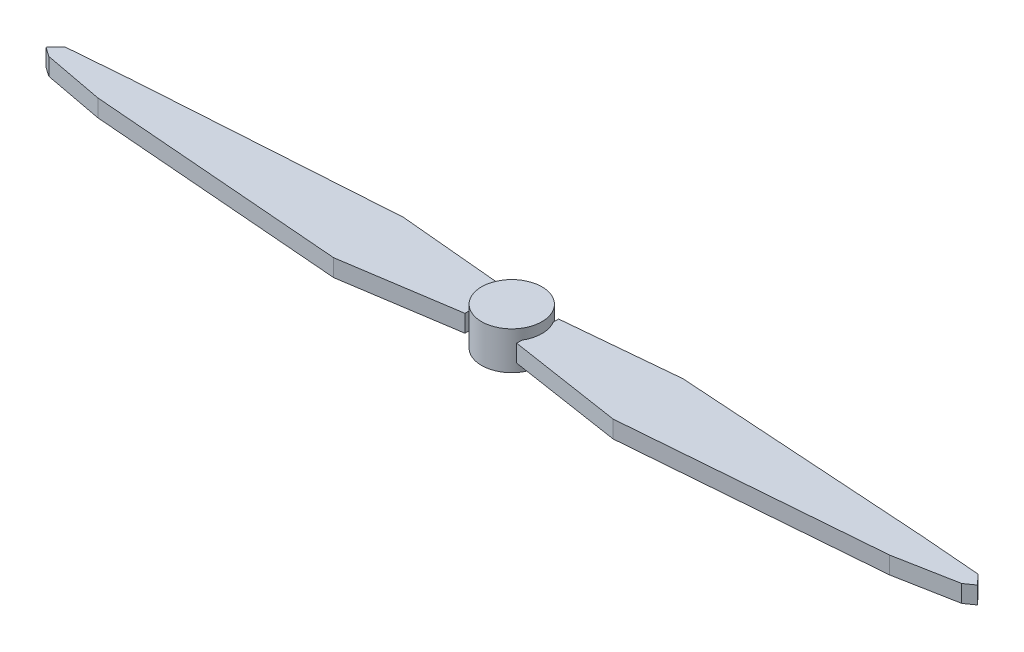
ISO-10303-21;
HEADER;
FILE_DESCRIPTION(('STEP AP214'),'2;1');
FILE_NAME('part.step','',(''),(''),'','','');
FILE_SCHEMA(('AUTOMOTIVE_DESIGN { 1 0 10303 214 1 1 1 1 }'));
ENDSEC;
DATA;
#1=APPLICATION_CONTEXT('core data for automotive mechanical design processes');
#2=APPLICATION_PROTOCOL_DEFINITION('international standard','automotive_design',2000,#1);
#3=PRODUCT_CONTEXT('',#1,'mechanical');
#4=PRODUCT('Part','Part','',(#3));
#5=PRODUCT_RELATED_PRODUCT_CATEGORY('part','',(#4));
#6=PRODUCT_DEFINITION_FORMATION('','',#4);
#7=PRODUCT_DEFINITION_CONTEXT('part definition',#1,'design');
#8=PRODUCT_DEFINITION('design','',#6,#7);
#9=PRODUCT_DEFINITION_SHAPE('','',#8);
#10=(LENGTH_UNIT() NAMED_UNIT(*) SI_UNIT(.MILLI.,.METRE.));
#11=(NAMED_UNIT(*) PLANE_ANGLE_UNIT() SI_UNIT($,.RADIAN.));
#12=(NAMED_UNIT(*) SI_UNIT($,.STERADIAN.) SOLID_ANGLE_UNIT());
#13=UNCERTAINTY_MEASURE_WITH_UNIT(LENGTH_MEASURE(1.E-05),#10,'distance_accuracy_value','');
#14=(GEOMETRIC_REPRESENTATION_CONTEXT(3) GLOBAL_UNCERTAINTY_ASSIGNED_CONTEXT((#13)) GLOBAL_UNIT_ASSIGNED_CONTEXT((#10,
#11,#12)) REPRESENTATION_CONTEXT('',''));
#15=CARTESIAN_POINT('',(0.,0.,0.));
#16=DIRECTION('',(0.,0.,1.));
#17=DIRECTION('',(1.,0.,0.));
#18=AXIS2_PLACEMENT_3D('',#15,#16,#17);
#19=CARTESIAN_POINT('',(12.,4.,-9.7155));
#20=DIRECTION('',(1.,0.,0.));
#21=DIRECTION('',(0.,0.,-1.));
#22=AXIS2_PLACEMENT_3D('',#19,#20,#21);
#23=PLANE('',#22);
#24=DIRECTION('',(0.,-1.,0.));
#25=VECTOR('',#24,1.);
#26=CARTESIAN_POINT('',(12.,8.8,7.21110255092798));
#27=LINE('',#26,#25);
#28=CARTESIAN_POINT('',(12.,-4.,7.21110255092798));
#29=VERTEX_POINT('',#28);
#30=CARTESIAN_POINT('',(12.,4.,7.21110255092798));
#31=VERTEX_POINT('',#30);
#32=EDGE_CURVE('E239',#29,#31,#27,.F.);
#33=ORIENTED_EDGE('',*,*,#32,.F.);
#34=DIRECTION('',(0.,0.,1.));
#35=VECTOR('',#34,1.);
#36=CARTESIAN_POINT('',(12.,-4.,-9.7155));
#37=LINE('',#36,#35);
#38=CARTESIAN_POINT('',(12.,-4.,9.7155));
#39=VERTEX_POINT('',#38);
#40=EDGE_CURVE('E243',#29,#39,#37,.T.);
#41=ORIENTED_EDGE('',*,*,#40,.T.);
#42=DIRECTION('',(0.,-1.,0.));
#43=VECTOR('',#42,1.);
#44=CARTESIAN_POINT('',(12.,4.,9.7155));
#45=LINE('',#44,#43);
#46=CARTESIAN_POINT('',(12.,4.,9.7155));
#47=VERTEX_POINT('',#46);
#48=EDGE_CURVE('E307',#47,#39,#45,.T.);
#49=ORIENTED_EDGE('',*,*,#48,.F.);
#50=DIRECTION('',(0.,0.,1.));
#51=VECTOR('',#50,1.);
#52=CARTESIAN_POINT('',(12.,4.,-9.7155));
#53=LINE('',#52,#51);
#54=EDGE_CURVE('E248',#31,#47,#53,.T.);
#55=ORIENTED_EDGE('',*,*,#54,.F.);
#56=EDGE_LOOP('',(#33,#41,#49,#55));
#57=FACE_BOUND('',#56,.T.);
#58=ADVANCED_FACE('F39',(#57),#23,.F.);
#59=DIRECTION('',(0.,-1.,0.));
#60=VECTOR('',#59,1.);
#61=CARTESIAN_POINT('',(12.,8.8,-7.21110255092798));
#62=LINE('',#61,#60);
#63=CARTESIAN_POINT('',(12.,4.,-7.21110255092798));
#64=VERTEX_POINT('',#63);
#65=CARTESIAN_POINT('',(12.,-4.,-7.21110255092798));
#66=VERTEX_POINT('',#65);
#67=EDGE_CURVE('E236',#64,#66,#62,.T.);
#68=ORIENTED_EDGE('',*,*,#67,.F.);
#69=CARTESIAN_POINT('',(12.,4.,-9.7155));
#70=VERTEX_POINT('',#69);
#71=EDGE_CURVE('E244',#70,#64,#53,.T.);
#72=ORIENTED_EDGE('',*,*,#71,.F.);
#73=DIRECTION('',(0.,-1.,0.));
#74=VECTOR('',#73,1.);
#75=CARTESIAN_POINT('',(12.,4.,-9.7155));
#76=LINE('',#75,#74);
#77=CARTESIAN_POINT('',(12.,-4.,-9.7155));
#78=VERTEX_POINT('',#77);
#79=EDGE_CURVE('E264',#70,#78,#76,.T.);
#80=ORIENTED_EDGE('',*,*,#79,.T.);
#81=EDGE_CURVE('E265',#78,#66,#37,.T.);
#82=ORIENTED_EDGE('',*,*,#81,.T.);
#83=EDGE_LOOP('',(#68,#72,#80,#82));
#84=FACE_BOUND('',#83,.T.);
#85=ADVANCED_FACE('F395',(#84),#23,.F.);
#86=CARTESIAN_POINT('',(12.,4.,9.7155));
#87=DIRECTION('',(0.151650746893093,0.,-0.988434140935433));
#88=DIRECTION('',(-0.988434140935433,0.,-0.151650746893093));
#89=AXIS2_PLACEMENT_3D('',#86,#87,#88);
#90=PLANE('',#89);
#91=DIRECTION('',(0.988434140935433,0.,0.151650746893093));
#92=VECTOR('',#91,1.);
#93=CARTESIAN_POINT('',(12.,-4.,9.7155));
#94=LINE('',#93,#92);
#95=CARTESIAN_POINT('',(64.77,-4.,17.81175));
#96=VERTEX_POINT('',#95);
#97=EDGE_CURVE('E268',#39,#96,#94,.T.);
#98=ORIENTED_EDGE('',*,*,#97,.T.);
#99=DIRECTION('',(0.,-1.,0.));
#100=VECTOR('',#99,1.);
#101=CARTESIAN_POINT('',(64.77,4.,17.81175));
#102=LINE('',#101,#100);
#103=CARTESIAN_POINT('',(64.77,4.,17.81175));
#104=VERTEX_POINT('',#103);
#105=EDGE_CURVE('E304',#104,#96,#102,.T.);
#106=ORIENTED_EDGE('',*,*,#105,.F.);
#107=DIRECTION('',(0.988434140935433,0.,0.151650746893093));
#108=VECTOR('',#107,1.);
#109=CARTESIAN_POINT('',(12.,4.,9.7155));
#110=LINE('',#109,#108);
#111=EDGE_CURVE('E247',#47,#104,#110,.T.);
#112=ORIENTED_EDGE('',*,*,#111,.F.);
#113=ORIENTED_EDGE('',*,*,#48,.T.);
#114=EDGE_LOOP('',(#98,#106,#112,#113));
#115=FACE_BOUND('',#114,.T.);
#116=ADVANCED_FACE('F401',(#115),#90,.F.);
#117=CARTESIAN_POINT('',(64.77,4.,17.81175));
#118=DIRECTION('',(-0.07974522228289,0.,-0.996815278536125));
#119=DIRECTION('',(-0.996815278536125,0.,0.07974522228289));
#120=AXIS2_PLACEMENT_3D('',#117,#118,#119);
#121=PLANE('',#120);
#122=DIRECTION('',(0.996815278536125,0.,-0.07974522228289));
#123=VECTOR('',#122,1.);
#124=CARTESIAN_POINT('',(64.77,-4.,17.81175));
#125=LINE('',#124,#123);
#126=CARTESIAN_POINT('',(183.515,-4.,8.31215));
#127=VERTEX_POINT('',#126);
#128=EDGE_CURVE('E270',#96,#127,#125,.T.);
#129=ORIENTED_EDGE('',*,*,#128,.T.);
#130=DIRECTION('',(0.,-1.,0.));
#131=VECTOR('',#130,1.);
#132=CARTESIAN_POINT('',(183.515,4.,8.31215));
#133=LINE('',#132,#131);
#134=CARTESIAN_POINT('',(183.515,4.,8.31215));
#135=VERTEX_POINT('',#134);
#136=EDGE_CURVE('E301',#135,#127,#133,.T.);
#137=ORIENTED_EDGE('',*,*,#136,.F.);
#138=DIRECTION('',(0.996815278536125,0.,-0.07974522228289));
#139=VECTOR('',#138,1.);
#140=CARTESIAN_POINT('',(64.77,4.,17.81175));
#141=LINE('',#140,#139);
#142=EDGE_CURVE('E250',#104,#135,#141,.T.);
#143=ORIENTED_EDGE('',*,*,#142,.F.);
#144=ORIENTED_EDGE('',*,*,#105,.T.);
#145=EDGE_LOOP('',(#129,#137,#143,#144));
#146=FACE_BOUND('',#145,.T.);
#147=ADVANCED_FACE('F455',(#146),#121,.F.);
#148=CARTESIAN_POINT('',(183.515,4.,8.31215));
#149=DIRECTION('',(-0.185201268913039,0.,-0.982700610558984));
#150=DIRECTION('',(-0.982700610558984,0.,0.185201268913039));
#151=AXIS2_PLACEMENT_3D('',#148,#149,#150);
#152=PLANE('',#151);
#153=DIRECTION('',(0.982700610558984,0.,-0.185201268913039));
#154=VECTOR('',#153,1.);
#155=CARTESIAN_POINT('',(183.515,-4.,8.31215));
#156=LINE('',#155,#154);
#157=CARTESIAN_POINT('',(211.582,-4.,3.0226));
#158=VERTEX_POINT('',#157);
#159=EDGE_CURVE('E272',#127,#158,#156,.T.);
#160=ORIENTED_EDGE('',*,*,#159,.T.);
#161=DIRECTION('',(0.,-1.,0.));
#162=VECTOR('',#161,1.);
#163=CARTESIAN_POINT('',(211.582,4.,3.0226));
#164=LINE('',#163,#162);
#165=CARTESIAN_POINT('',(211.582,4.,3.0226));
#166=VERTEX_POINT('',#165);
#167=EDGE_CURVE('E298',#166,#158,#164,.T.);
#168=ORIENTED_EDGE('',*,*,#167,.F.);
#169=DIRECTION('',(0.982700610558984,0.,-0.185201268913039));
#170=VECTOR('',#169,1.);
#171=CARTESIAN_POINT('',(183.515,4.,8.31215));
#172=LINE('',#171,#170);
#173=EDGE_CURVE('E252',#135,#166,#172,.T.);
#174=ORIENTED_EDGE('',*,*,#173,.F.);
#175=ORIENTED_EDGE('',*,*,#136,.T.);
#176=EDGE_LOOP('',(#160,#168,#174,#175));
#177=FACE_BOUND('',#176,.T.);
#178=ADVANCED_FACE('F453',(#177),#152,.F.);
#179=CARTESIAN_POINT('',(211.582,4.,3.0226));
#180=DIRECTION('',(-0.573462344363327,0.,-0.819231920519042));
#181=DIRECTION('',(-0.819231920519042,0.,0.573462344363327));
#182=AXIS2_PLACEMENT_3D('',#179,#180,#181);
#183=PLANE('',#182);
#184=DIRECTION('',(0.819231920519041,0.,-0.573462344363327));
#185=VECTOR('',#184,1.);
#186=CARTESIAN_POINT('',(211.582,-4.,3.0226));
#187=LINE('',#186,#185);
#188=CARTESIAN_POINT('',(215.9,-4.,0.));
#189=VERTEX_POINT('',#188);
#190=EDGE_CURVE('E274',#158,#189,#187,.T.);
#191=ORIENTED_EDGE('',*,*,#190,.T.);
#192=DIRECTION('',(0.,-1.,0.));
#193=VECTOR('',#192,1.);
#194=CARTESIAN_POINT('',(215.9,4.,0.));
#195=LINE('',#194,#193);
#196=CARTESIAN_POINT('',(215.9,4.,0.));
#197=VERTEX_POINT('',#196);
#198=EDGE_CURVE('E295',#197,#189,#195,.T.);
#199=ORIENTED_EDGE('',*,*,#198,.F.);
#200=DIRECTION('',(0.819231920519041,0.,-0.573462344363327));
#201=VECTOR('',#200,1.);
#202=CARTESIAN_POINT('',(211.582,4.,3.0226));
#203=LINE('',#202,#201);
#204=EDGE_CURVE('E254',#166,#197,#203,.T.);
#205=ORIENTED_EDGE('',*,*,#204,.F.);
#206=ORIENTED_EDGE('',*,*,#167,.T.);
#207=EDGE_LOOP('',(#191,#199,#205,#206));
#208=FACE_BOUND('',#207,.T.);
#209=ADVANCED_FACE('F449',(#208),#183,.F.);
#210=CARTESIAN_POINT('',(215.9,4.,0.));
#211=DIRECTION('',(-0.724137931034482,0.,0.689655172413794));
#212=DIRECTION('',(0.689655172413794,0.,0.724137931034482));
#213=AXIS2_PLACEMENT_3D('',#210,#211,#212);
#214=PLANE('',#213);
#215=DIRECTION('',(-0.689655172413794,0.,-0.724137931034482));
#216=VECTOR('',#215,1.);
#217=CARTESIAN_POINT('',(215.9,-4.,0.));
#218=LINE('',#217,#216);
#219=CARTESIAN_POINT('',(211.582,-4.,-4.5339));
#220=VERTEX_POINT('',#219);
#221=EDGE_CURVE('E276',#189,#220,#218,.T.);
#222=ORIENTED_EDGE('',*,*,#221,.T.);
#223=DIRECTION('',(0.,-1.,0.));
#224=VECTOR('',#223,1.);
#225=CARTESIAN_POINT('',(211.582,4.,-4.5339));
#226=LINE('',#225,#224);
#227=CARTESIAN_POINT('',(211.582,4.,-4.5339));
#228=VERTEX_POINT('',#227);
#229=EDGE_CURVE('E292',#228,#220,#226,.T.);
#230=ORIENTED_EDGE('',*,*,#229,.F.);
#231=DIRECTION('',(-0.689655172413794,0.,-0.724137931034482));
#232=VECTOR('',#231,1.);
#233=CARTESIAN_POINT('',(215.9,4.,0.));
#234=LINE('',#233,#232);
#235=EDGE_CURVE('E256',#197,#228,#234,.T.);
#236=ORIENTED_EDGE('',*,*,#235,.F.);
#237=ORIENTED_EDGE('',*,*,#198,.T.);
#238=EDGE_LOOP('',(#222,#230,#236,#237));
#239=FACE_BOUND('',#238,.T.);
#240=ADVANCED_FACE('F444',(#239),#214,.F.);
#241=CARTESIAN_POINT('',(211.582,4.,-4.5339));
#242=DIRECTION('',(-0.0805070569764701,0.,0.996754038756296));
#243=DIRECTION('',(0.996754038756296,0.,0.0805070569764701));
#244=AXIS2_PLACEMENT_3D('',#241,#242,#243);
#245=PLANE('',#244);
#246=DIRECTION('',(-0.996754038756296,0.,-0.0805070569764701));
#247=VECTOR('',#246,1.);
#248=CARTESIAN_POINT('',(211.582,-4.,-4.5339));
#249=LINE('',#248,#247);
#250=CARTESIAN_POINT('',(183.515,-4.,-6.80085));
#251=VERTEX_POINT('',#250);
#252=EDGE_CURVE('E278',#220,#251,#249,.T.);
#253=ORIENTED_EDGE('',*,*,#252,.T.);
#254=DIRECTION('',(0.,-1.,0.));
#255=VECTOR('',#254,1.);
#256=CARTESIAN_POINT('',(183.515,4.,-6.80085));
#257=LINE('',#256,#255);
#258=CARTESIAN_POINT('',(183.515,4.,-6.80085));
#259=VERTEX_POINT('',#258);
#260=EDGE_CURVE('E289',#259,#251,#257,.T.);
#261=ORIENTED_EDGE('',*,*,#260,.F.);
#262=DIRECTION('',(-0.996754038756296,0.,-0.0805070569764701));
#263=VECTOR('',#262,1.);
#264=CARTESIAN_POINT('',(211.582,4.,-4.5339));
#265=LINE('',#264,#263);
#266=EDGE_CURVE('E258',#228,#259,#265,.T.);
#267=ORIENTED_EDGE('',*,*,#266,.F.);
#268=ORIENTED_EDGE('',*,*,#229,.T.);
#269=EDGE_LOOP('',(#253,#261,#267,#268));
#270=FACE_BOUND('',#269,.T.);
#271=ADVANCED_FACE('F439',(#270),#245,.F.);
#272=CARTESIAN_POINT('',(183.515,4.,-6.80085));
#273=DIRECTION('',(-0.0653147810154766,0.,0.99786470995867));
#274=DIRECTION('',(0.99786470995867,0.,0.0653147810154766));
#275=AXIS2_PLACEMENT_3D('',#272,#273,#274);
#276=PLANE('',#275);
#277=DIRECTION('',(-0.99786470995867,0.,-0.0653147810154766));
#278=VECTOR('',#277,1.);
#279=CARTESIAN_POINT('',(183.515,-4.,-6.80085));
#280=LINE('',#279,#278);
#281=CARTESIAN_POINT('',(64.77,-4.,-14.57325));
#282=VERTEX_POINT('',#281);
#283=EDGE_CURVE('E280',#251,#282,#280,.T.);
#284=ORIENTED_EDGE('',*,*,#283,.T.);
#285=DIRECTION('',(0.,-1.,0.));
#286=VECTOR('',#285,1.);
#287=CARTESIAN_POINT('',(64.77,4.,-14.57325));
#288=LINE('',#287,#286);
#289=CARTESIAN_POINT('',(64.77,4.,-14.57325));
#290=VERTEX_POINT('',#289);
#291=EDGE_CURVE('E286',#290,#282,#288,.T.);
#292=ORIENTED_EDGE('',*,*,#291,.F.);
#293=DIRECTION('',(-0.99786470995867,0.,-0.0653147810154766));
#294=VECTOR('',#293,1.);
#295=CARTESIAN_POINT('',(183.515,4.,-6.80085));
#296=LINE('',#295,#294);
#297=EDGE_CURVE('E260',#259,#290,#296,.T.);
#298=ORIENTED_EDGE('',*,*,#297,.F.);
#299=ORIENTED_EDGE('',*,*,#260,.T.);
#300=EDGE_LOOP('',(#284,#292,#298,#299));
#301=FACE_BOUND('',#300,.T.);
#302=ADVANCED_FACE('F435',(#301),#276,.F.);
#303=CARTESIAN_POINT('',(64.77,4.,-14.57325));
#304=DIRECTION('',(0.0916675620231843,0.,0.995789665578392));
#305=DIRECTION('',(0.995789665578392,0.,-0.0916675620231843));
#306=AXIS2_PLACEMENT_3D('',#303,#304,#305);
#307=PLANE('',#306);
#308=DIRECTION('',(-0.995789665578392,0.,0.0916675620231843));
#309=VECTOR('',#308,1.);
#310=CARTESIAN_POINT('',(64.77,-4.,-14.57325));
#311=LINE('',#310,#309);
#312=EDGE_CURVE('E282',#282,#78,#311,.T.);
#313=ORIENTED_EDGE('',*,*,#312,.T.);
#314=ORIENTED_EDGE('',*,*,#79,.F.);
#315=DIRECTION('',(-0.995789665578392,0.,0.0916675620231843));
#316=VECTOR('',#315,1.);
#317=CARTESIAN_POINT('',(64.77,4.,-14.57325));
#318=LINE('',#317,#316);
#319=EDGE_CURVE('E262',#290,#70,#318,.T.);
#320=ORIENTED_EDGE('',*,*,#319,.F.);
#321=ORIENTED_EDGE('',*,*,#291,.T.);
#322=EDGE_LOOP('',(#313,#314,#320,#321));
#323=FACE_BOUND('',#322,.T.);
#324=ADVANCED_FACE('F430',(#323),#307,.F.);
#325=CARTESIAN_POINT('',(0.,4.,0.));
#326=DIRECTION('',(0.,-1.,0.));
#327=DIRECTION('',(0.,0.,-1.));
#328=AXIS2_PLACEMENT_3D('',#325,#326,#327);
#329=PLANE('',#328);
#330=CARTESIAN_POINT('',(0.,4.,0.));
#331=DIRECTION('',(0.,-1.,0.));
#332=DIRECTION('',(0.,0.,-1.));
#333=AXIS2_PLACEMENT_3D('',#330,#331,#332);
#334=CIRCLE('',#333,14.);
#335=EDGE_CURVE('E241',#31,#64,#334,.F.);
#336=ORIENTED_EDGE('',*,*,#335,.F.);
#337=ORIENTED_EDGE('',*,*,#54,.T.);
#338=ORIENTED_EDGE('',*,*,#111,.T.);
#339=ORIENTED_EDGE('',*,*,#142,.T.);
#340=ORIENTED_EDGE('',*,*,#173,.T.);
#341=ORIENTED_EDGE('',*,*,#204,.T.);
#342=ORIENTED_EDGE('',*,*,#235,.T.);
#343=ORIENTED_EDGE('',*,*,#266,.T.);
#344=ORIENTED_EDGE('',*,*,#297,.T.);
#345=ORIENTED_EDGE('',*,*,#319,.T.);
#346=ORIENTED_EDGE('',*,*,#71,.T.);
#347=EDGE_LOOP('',(#336,#337,#338,#339,#340,#341,#342,#343,#344,#345,#346));
#348=FACE_BOUND('',#347,.T.);
#349=ADVANCED_FACE('F420',(#348),#329,.F.);
#350=CARTESIAN_POINT('',(0.,-4.,0.));
#351=DIRECTION('',(0.,-1.,0.));
#352=DIRECTION('',(0.,0.,-1.));
#353=AXIS2_PLACEMENT_3D('',#350,#351,#352);
#354=PLANE('',#353);
#355=ORIENTED_EDGE('',*,*,#40,.F.);
#356=CARTESIAN_POINT('',(0.,-4.,0.));
#357=DIRECTION('',(0.,-1.,0.));
#358=DIRECTION('',(0.,0.,-1.));
#359=AXIS2_PLACEMENT_3D('',#356,#357,#358);
#360=CIRCLE('',#359,14.);
#361=EDGE_CURVE('E310',#29,#66,#360,.F.);
#362=ORIENTED_EDGE('',*,*,#361,.T.);
#363=ORIENTED_EDGE('',*,*,#81,.F.);
#364=ORIENTED_EDGE('',*,*,#312,.F.);
#365=ORIENTED_EDGE('',*,*,#283,.F.);
#366=ORIENTED_EDGE('',*,*,#252,.F.);
#367=ORIENTED_EDGE('',*,*,#221,.F.);
#368=ORIENTED_EDGE('',*,*,#190,.F.);
#369=ORIENTED_EDGE('',*,*,#159,.F.);
#370=ORIENTED_EDGE('',*,*,#128,.F.);
#371=ORIENTED_EDGE('',*,*,#97,.F.);
#372=EDGE_LOOP('',(#355,#362,#363,#364,#365,#366,#367,#368,#369,#370,#371));
#373=FACE_BOUND('',#372,.T.);
#374=ADVANCED_FACE('F411',(#373),#354,.T.);
#375=CARTESIAN_POINT('',(0.,8.8,0.));
#376=DIRECTION('',(0.,-1.,0.));
#377=DIRECTION('',(0.,0.,-1.));
#378=AXIS2_PLACEMENT_3D('',#375,#376,#377);
#379=CYLINDRICAL_SURFACE('',#378,14.);
#380=DIRECTION('',(0.,-1.,0.));
#381=VECTOR('',#380,1.);
#382=CARTESIAN_POINT('',(-12.,8.8,-7.21110255092798));
#383=LINE('',#382,#381);
#384=CARTESIAN_POINT('',(-12.,4.,-7.21110255092798));
#385=VERTEX_POINT('',#384);
#386=CARTESIAN_POINT('',(-12.,-4.,-7.21110255092798));
#387=VERTEX_POINT('',#386);
#388=EDGE_CURVE('E46',#385,#387,#383,.T.);
#389=ORIENTED_EDGE('',*,*,#388,.F.);
#390=CARTESIAN_POINT('',(0.,4.,0.));
#391=DIRECTION('',(0.,1.,0.));
#392=DIRECTION('',(0.,0.,1.));
#393=AXIS2_PLACEMENT_3D('',#390,#391,#392);
#394=CIRCLE('',#393,14.);
#395=CARTESIAN_POINT('',(-12.,4.,7.21110255092798));
#396=VERTEX_POINT('',#395);
#397=EDGE_CURVE('E11',#385,#396,#394,.T.);
#398=ORIENTED_EDGE('',*,*,#397,.T.);
#399=DIRECTION('',(0.,-1.,0.));
#400=VECTOR('',#399,1.);
#401=CARTESIAN_POINT('',(-12.,8.8,7.21110255092798));
#402=LINE('',#401,#400);
#403=CARTESIAN_POINT('',(-12.,-4.,7.21110255092798));
#404=VERTEX_POINT('',#403);
#405=EDGE_CURVE('E314',#404,#396,#402,.F.);
#406=ORIENTED_EDGE('',*,*,#405,.F.);
#407=CARTESIAN_POINT('',(0.,-4.,0.));
#408=DIRECTION('',(0.,1.,0.));
#409=DIRECTION('',(0.,0.,1.));
#410=AXIS2_PLACEMENT_3D('',#407,#408,#409);
#411=CIRCLE('',#410,14.);
#412=EDGE_CURVE('E207',#387,#404,#411,.T.);
#413=ORIENTED_EDGE('',*,*,#412,.F.);
#414=EDGE_LOOP('',(#389,#398,#406,#413));
#415=FACE_BOUND('',#414,.T.);
#416=CARTESIAN_POINT('',(0.,8.8,0.));
#417=DIRECTION('',(0.,1.,0.));
#418=DIRECTION('',(0.,0.,1.));
#419=AXIS2_PLACEMENT_3D('',#416,#417,#418);
#420=CIRCLE('',#419,14.);
#421=CARTESIAN_POINT('',(0.,8.8,14.));
#422=VERTEX_POINT('',#421);
#423=EDGE_CURVE('E212',#422,#422,#420,.T.);
#424=ORIENTED_EDGE('',*,*,#423,.F.);
#425=EDGE_LOOP('',(#424));
#426=FACE_BOUND('',#425,.T.);
#427=CARTESIAN_POINT('',(0.,-8.8,0.));
#428=DIRECTION('',(0.,1.,0.));
#429=DIRECTION('',(0.,0.,1.));
#430=AXIS2_PLACEMENT_3D('',#427,#428,#429);
#431=CIRCLE('',#430,14.);
#432=CARTESIAN_POINT('',(0.,-8.8,14.));
#433=VERTEX_POINT('',#432);
#434=EDGE_CURVE('E208',#433,#433,#431,.T.);
#435=ORIENTED_EDGE('',*,*,#434,.T.);
#436=EDGE_LOOP('',(#435));
#437=FACE_BOUND('',#436,.T.);
#438=ORIENTED_EDGE('',*,*,#32,.T.);
#439=ORIENTED_EDGE('',*,*,#335,.T.);
#440=ORIENTED_EDGE('',*,*,#67,.T.);
#441=ORIENTED_EDGE('',*,*,#361,.F.);
#442=EDGE_LOOP('',(#438,#439,#440,#441));
#443=FACE_BOUND('',#442,.T.);
#444=ADVANCED_FACE('F424',(#415,#426,#437,#443),#379,.T.);
#445=CARTESIAN_POINT('',(0.,8.8,0.));
#446=DIRECTION('',(0.,1.,0.));
#447=DIRECTION('',(0.,0.,1.));
#448=AXIS2_PLACEMENT_3D('',#445,#446,#447);
#449=PLANE('',#448);
#450=ORIENTED_EDGE('',*,*,#423,.T.);
#451=EDGE_LOOP('',(#450));
#452=FACE_BOUND('',#451,.T.);
#453=ADVANCED_FACE('F479',(#452),#449,.T.);
#454=CARTESIAN_POINT('',(0.,-8.8,0.));
#455=DIRECTION('',(0.,1.,0.));
#456=DIRECTION('',(0.,0.,1.));
#457=AXIS2_PLACEMENT_3D('',#454,#455,#456);
#458=PLANE('',#457);
#459=ORIENTED_EDGE('',*,*,#434,.F.);
#460=EDGE_LOOP('',(#459));
#461=FACE_BOUND('',#460,.T.);
#462=ADVANCED_FACE('F480',(#461),#458,.F.);
#463=CARTESIAN_POINT('',(-12.,4.,-9.7155));
#464=DIRECTION('',(-1.,0.,0.));
#465=DIRECTION('',(0.,0.,1.));
#466=AXIS2_PLACEMENT_3D('',#463,#464,#465);
#467=PLANE('',#466);
#468=DIRECTION('',(0.,0.,-1.));
#469=VECTOR('',#468,1.);
#470=CARTESIAN_POINT('',(-12.,4.,-9.7155));
#471=LINE('',#470,#469);
#472=CARTESIAN_POINT('',(-12.,4.,-9.7155));
#473=VERTEX_POINT('',#472);
#474=EDGE_CURVE('E233',#385,#473,#471,.T.);
#475=ORIENTED_EDGE('',*,*,#474,.F.);
#476=ORIENTED_EDGE('',*,*,#388,.T.);
#477=DIRECTION('',(0.,0.,-1.));
#478=VECTOR('',#477,1.);
#479=CARTESIAN_POINT('',(-12.,-4.,-9.7155));
#480=LINE('',#479,#478);
#481=CARTESIAN_POINT('',(-12.,-4.,-9.7155));
#482=VERTEX_POINT('',#481);
#483=EDGE_CURVE('E209',#387,#482,#480,.T.);
#484=ORIENTED_EDGE('',*,*,#483,.T.);
#485=DIRECTION('',(0.,-1.,0.));
#486=VECTOR('',#485,1.);
#487=CARTESIAN_POINT('',(-12.,4.,-9.7155));
#488=LINE('',#487,#486);
#489=EDGE_CURVE('E328',#473,#482,#488,.T.);
#490=ORIENTED_EDGE('',*,*,#489,.F.);
#491=EDGE_LOOP('',(#475,#476,#484,#490));
#492=FACE_BOUND('',#491,.T.);
#493=ADVANCED_FACE('F317',(#492),#467,.F.);
#494=CARTESIAN_POINT('',(-12.,-4.,9.7155));
#495=VERTEX_POINT('',#494);
#496=EDGE_CURVE('E200',#495,#404,#480,.T.);
#497=ORIENTED_EDGE('',*,*,#496,.T.);
#498=ORIENTED_EDGE('',*,*,#405,.T.);
#499=CARTESIAN_POINT('',(-12.,4.,9.7155));
#500=VERTEX_POINT('',#499);
#501=EDGE_CURVE('E195',#500,#396,#471,.T.);
#502=ORIENTED_EDGE('',*,*,#501,.F.);
#503=DIRECTION('',(0.,-1.,0.));
#504=VECTOR('',#503,1.);
#505=CARTESIAN_POINT('',(-12.,4.,9.7155));
#506=LINE('',#505,#504);
#507=EDGE_CURVE('E187',#500,#495,#506,.T.);
#508=ORIENTED_EDGE('',*,*,#507,.T.);
#509=EDGE_LOOP('',(#497,#498,#502,#508));
#510=FACE_BOUND('',#509,.T.);
#511=ADVANCED_FACE('F199',(#510),#467,.F.);
#512=CARTESIAN_POINT('',(-64.77,4.,-14.57325));
#513=DIRECTION('',(-0.0916675620231843,0.,0.995789665578392));
#514=DIRECTION('',(0.995789665578392,0.,0.0916675620231843));
#515=AXIS2_PLACEMENT_3D('',#512,#513,#514);
#516=PLANE('',#515);
#517=DIRECTION('',(-0.995789665578392,0.,-0.0916675620231843));
#518=VECTOR('',#517,1.);
#519=CARTESIAN_POINT('',(-64.77,-4.,-14.57325));
#520=LINE('',#519,#518);
#521=CARTESIAN_POINT('',(-64.77,-4.,-14.57325));
#522=VERTEX_POINT('',#521);
#523=EDGE_CURVE('E214',#482,#522,#520,.T.);
#524=ORIENTED_EDGE('',*,*,#523,.T.);
#525=DIRECTION('',(0.,-1.,0.));
#526=VECTOR('',#525,1.);
#527=CARTESIAN_POINT('',(-64.77,4.,-14.57325));
#528=LINE('',#527,#526);
#529=CARTESIAN_POINT('',(-64.77,4.,-14.57325));
#530=VERTEX_POINT('',#529);
#531=EDGE_CURVE('E330',#530,#522,#528,.T.);
#532=ORIENTED_EDGE('',*,*,#531,.F.);
#533=DIRECTION('',(-0.995789665578392,0.,-0.0916675620231843));
#534=VECTOR('',#533,1.);
#535=CARTESIAN_POINT('',(-64.77,4.,-14.57325));
#536=LINE('',#535,#534);
#537=EDGE_CURVE('E231',#473,#530,#536,.T.);
#538=ORIENTED_EDGE('',*,*,#537,.F.);
#539=ORIENTED_EDGE('',*,*,#489,.T.);
#540=EDGE_LOOP('',(#524,#532,#538,#539));
#541=FACE_BOUND('',#540,.T.);
#542=ADVANCED_FACE('F329',(#541),#516,.F.);
#543=CARTESIAN_POINT('',(-183.515,4.,-6.80085));
#544=DIRECTION('',(0.0653147810154766,0.,0.99786470995867));
#545=DIRECTION('',(0.99786470995867,0.,-0.0653147810154766));
#546=AXIS2_PLACEMENT_3D('',#543,#544,#545);
#547=PLANE('',#546);
#548=DIRECTION('',(-0.99786470995867,0.,0.0653147810154766));
#549=VECTOR('',#548,1.);
#550=CARTESIAN_POINT('',(-183.515,-4.,-6.80085));
#551=LINE('',#550,#549);
#552=CARTESIAN_POINT('',(-183.515,-4.,-6.80085));
#553=VERTEX_POINT('',#552);
#554=EDGE_CURVE('E323',#522,#553,#551,.T.);
#555=ORIENTED_EDGE('',*,*,#554,.T.);
#556=DIRECTION('',(0.,-1.,0.));
#557=VECTOR('',#556,1.);
#558=CARTESIAN_POINT('',(-183.515,4.,-6.80085));
#559=LINE('',#558,#557);
#560=CARTESIAN_POINT('',(-183.515,4.,-6.80085));
#561=VERTEX_POINT('',#560);
#562=EDGE_CURVE('E332',#561,#553,#559,.T.);
#563=ORIENTED_EDGE('',*,*,#562,.F.);
#564=DIRECTION('',(-0.99786470995867,0.,0.0653147810154766));
#565=VECTOR('',#564,1.);
#566=CARTESIAN_POINT('',(-183.515,4.,-6.80085));
#567=LINE('',#566,#565);
#568=EDGE_CURVE('E229',#530,#561,#567,.T.);
#569=ORIENTED_EDGE('',*,*,#568,.F.);
#570=ORIENTED_EDGE('',*,*,#531,.T.);
#571=EDGE_LOOP('',(#555,#563,#569,#570));
#572=FACE_BOUND('',#571,.T.);
#573=ADVANCED_FACE('F360',(#572),#547,.F.);
#574=CARTESIAN_POINT('',(-211.582,4.,-4.5339));
#575=DIRECTION('',(0.0805070569764701,0.,0.996754038756296));
#576=DIRECTION('',(0.996754038756296,0.,-0.0805070569764701));
#577=AXIS2_PLACEMENT_3D('',#574,#575,#576);
#578=PLANE('',#577);
#579=DIRECTION('',(-0.996754038756296,0.,0.0805070569764701));
#580=VECTOR('',#579,1.);
#581=CARTESIAN_POINT('',(-211.582,-4.,-4.5339));
#582=LINE('',#581,#580);
#583=CARTESIAN_POINT('',(-211.582,-4.,-4.5339));
#584=VERTEX_POINT('',#583);
#585=EDGE_CURVE('E357',#553,#584,#582,.T.);
#586=ORIENTED_EDGE('',*,*,#585,.T.);
#587=DIRECTION('',(0.,-1.,0.));
#588=VECTOR('',#587,1.);
#589=CARTESIAN_POINT('',(-211.582,4.,-4.5339));
#590=LINE('',#589,#588);
#591=CARTESIAN_POINT('',(-211.582,4.,-4.5339));
#592=VERTEX_POINT('',#591);
#593=EDGE_CURVE('E337',#592,#584,#590,.T.);
#594=ORIENTED_EDGE('',*,*,#593,.F.);
#595=DIRECTION('',(-0.996754038756296,0.,0.0805070569764701));
#596=VECTOR('',#595,1.);
#597=CARTESIAN_POINT('',(-211.582,4.,-4.5339));
#598=LINE('',#597,#596);
#599=EDGE_CURVE('E227',#561,#592,#598,.T.);
#600=ORIENTED_EDGE('',*,*,#599,.F.);
#601=ORIENTED_EDGE('',*,*,#562,.T.);
#602=EDGE_LOOP('',(#586,#594,#600,#601));
#603=FACE_BOUND('',#602,.T.);
#604=ADVANCED_FACE('F364',(#603),#578,.F.);
#605=CARTESIAN_POINT('',(-215.9,4.,0.));
#606=DIRECTION('',(0.724137931034482,0.,0.689655172413794));
#607=DIRECTION('',(0.689655172413794,0.,-0.724137931034482));
#608=AXIS2_PLACEMENT_3D('',#605,#606,#607);
#609=PLANE('',#608);
#610=DIRECTION('',(-0.689655172413794,0.,0.724137931034482));
#611=VECTOR('',#610,1.);
#612=CARTESIAN_POINT('',(-215.9,-4.,0.));
#613=LINE('',#612,#611);
#614=CARTESIAN_POINT('',(-215.9,-4.,0.));
#615=VERTEX_POINT('',#614);
#616=EDGE_CURVE('E355',#584,#615,#613,.T.);
#617=ORIENTED_EDGE('',*,*,#616,.T.);
#618=DIRECTION('',(0.,-1.,0.));
#619=VECTOR('',#618,1.);
#620=CARTESIAN_POINT('',(-215.9,4.,0.));
#621=LINE('',#620,#619);
#622=CARTESIAN_POINT('',(-215.9,4.,0.));
#623=VERTEX_POINT('',#622);
#624=EDGE_CURVE('E340',#623,#615,#621,.T.);
#625=ORIENTED_EDGE('',*,*,#624,.F.);
#626=DIRECTION('',(-0.689655172413794,0.,0.724137931034482));
#627=VECTOR('',#626,1.);
#628=CARTESIAN_POINT('',(-215.9,4.,0.));
#629=LINE('',#628,#627);
#630=EDGE_CURVE('E225',#592,#623,#629,.T.);
#631=ORIENTED_EDGE('',*,*,#630,.F.);
#632=ORIENTED_EDGE('',*,*,#593,.T.);
#633=EDGE_LOOP('',(#617,#625,#631,#632));
#634=FACE_BOUND('',#633,.T.);
#635=ADVANCED_FACE('F371',(#634),#609,.F.);
#636=CARTESIAN_POINT('',(-211.582,4.,3.0226));
#637=DIRECTION('',(0.573462344363327,0.,-0.819231920519042));
#638=DIRECTION('',(-0.819231920519042,0.,-0.573462344363327));
#639=AXIS2_PLACEMENT_3D('',#636,#637,#638);
#640=PLANE('',#639);
#641=DIRECTION('',(0.819231920519041,0.,0.573462344363327));
#642=VECTOR('',#641,1.);
#643=CARTESIAN_POINT('',(-211.582,-4.,3.0226));
#644=LINE('',#643,#642);
#645=CARTESIAN_POINT('',(-211.582,-4.,3.0226));
#646=VERTEX_POINT('',#645);
#647=EDGE_CURVE('E353',#615,#646,#644,.T.);
#648=ORIENTED_EDGE('',*,*,#647,.T.);
#649=DIRECTION('',(0.,-1.,0.));
#650=VECTOR('',#649,1.);
#651=CARTESIAN_POINT('',(-211.582,4.,3.0226));
#652=LINE('',#651,#650);
#653=CARTESIAN_POINT('',(-211.582,4.,3.0226));
#654=VERTEX_POINT('',#653);
#655=EDGE_CURVE('E343',#654,#646,#652,.T.);
#656=ORIENTED_EDGE('',*,*,#655,.F.);
#657=DIRECTION('',(0.819231920519041,0.,0.573462344363327));
#658=VECTOR('',#657,1.);
#659=CARTESIAN_POINT('',(-211.582,4.,3.0226));
#660=LINE('',#659,#658);
#661=EDGE_CURVE('E223',#623,#654,#660,.T.);
#662=ORIENTED_EDGE('',*,*,#661,.F.);
#663=ORIENTED_EDGE('',*,*,#624,.T.);
#664=EDGE_LOOP('',(#648,#656,#662,#663));
#665=FACE_BOUND('',#664,.T.);
#666=ADVANCED_FACE('F375',(#665),#640,.F.);
#667=CARTESIAN_POINT('',(-183.515,4.,8.31215));
#668=DIRECTION('',(0.185201268913039,0.,-0.982700610558984));
#669=DIRECTION('',(-0.982700610558984,0.,-0.185201268913039));
#670=AXIS2_PLACEMENT_3D('',#667,#668,#669);
#671=PLANE('',#670);
#672=DIRECTION('',(0.982700610558984,0.,0.185201268913039));
#673=VECTOR('',#672,1.);
#674=CARTESIAN_POINT('',(-183.515,-4.,8.31215));
#675=LINE('',#674,#673);
#676=CARTESIAN_POINT('',(-183.515,-4.,8.31215));
#677=VERTEX_POINT('',#676);
#678=EDGE_CURVE('E351',#646,#677,#675,.T.);
#679=ORIENTED_EDGE('',*,*,#678,.T.);
#680=DIRECTION('',(0.,-1.,0.));
#681=VECTOR('',#680,1.);
#682=CARTESIAN_POINT('',(-183.515,4.,8.31215));
#683=LINE('',#682,#681);
#684=CARTESIAN_POINT('',(-183.515,4.,8.31215));
#685=VERTEX_POINT('',#684);
#686=EDGE_CURVE('E346',#685,#677,#683,.T.);
#687=ORIENTED_EDGE('',*,*,#686,.F.);
#688=DIRECTION('',(0.982700610558984,0.,0.185201268913039));
#689=VECTOR('',#688,1.);
#690=CARTESIAN_POINT('',(-183.515,4.,8.31215));
#691=LINE('',#690,#689);
#692=EDGE_CURVE('E221',#654,#685,#691,.T.);
#693=ORIENTED_EDGE('',*,*,#692,.F.);
#694=ORIENTED_EDGE('',*,*,#655,.T.);
#695=EDGE_LOOP('',(#679,#687,#693,#694));
#696=FACE_BOUND('',#695,.T.);
#697=ADVANCED_FACE('F385',(#696),#671,.F.);
#698=CARTESIAN_POINT('',(-64.77,4.,17.81175));
#699=DIRECTION('',(0.07974522228289,0.,-0.996815278536125));
#700=DIRECTION('',(-0.996815278536125,0.,-0.07974522228289));
#701=AXIS2_PLACEMENT_3D('',#698,#699,#700);
#702=PLANE('',#701);
#703=DIRECTION('',(0.996815278536125,0.,0.07974522228289));
#704=VECTOR('',#703,1.);
#705=CARTESIAN_POINT('',(-64.77,-4.,17.81175));
#706=LINE('',#705,#704);
#707=CARTESIAN_POINT('',(-64.77,-4.,17.81175));
#708=VERTEX_POINT('',#707);
#709=EDGE_CURVE('E194',#677,#708,#706,.T.);
#710=ORIENTED_EDGE('',*,*,#709,.T.);
#711=DIRECTION('',(0.,-1.,0.));
#712=VECTOR('',#711,1.);
#713=CARTESIAN_POINT('',(-64.77,4.,17.81175));
#714=LINE('',#713,#712);
#715=CARTESIAN_POINT('',(-64.77,4.,17.81175));
#716=VERTEX_POINT('',#715);
#717=EDGE_CURVE('E190',#716,#708,#714,.T.);
#718=ORIENTED_EDGE('',*,*,#717,.F.);
#719=DIRECTION('',(0.996815278536125,0.,0.07974522228289));
#720=VECTOR('',#719,1.);
#721=CARTESIAN_POINT('',(-64.77,4.,17.81175));
#722=LINE('',#721,#720);
#723=EDGE_CURVE('E219',#685,#716,#722,.T.);
#724=ORIENTED_EDGE('',*,*,#723,.F.);
#725=ORIENTED_EDGE('',*,*,#686,.T.);
#726=EDGE_LOOP('',(#710,#718,#724,#725));
#727=FACE_BOUND('',#726,.T.);
#728=ADVANCED_FACE('F383',(#727),#702,.F.);
#729=CARTESIAN_POINT('',(-12.,4.,9.7155));
#730=DIRECTION('',(-0.151650746893093,0.,-0.988434140935433));
#731=DIRECTION('',(-0.988434140935433,0.,0.151650746893093));
#732=AXIS2_PLACEMENT_3D('',#729,#730,#731);
#733=PLANE('',#732);
#734=DIRECTION('',(0.988434140935433,0.,-0.151650746893093));
#735=VECTOR('',#734,1.);
#736=CARTESIAN_POINT('',(-12.,-4.,9.7155));
#737=LINE('',#736,#735);
#738=EDGE_CURVE('E183',#708,#495,#737,.T.);
#739=ORIENTED_EDGE('',*,*,#738,.T.);
#740=ORIENTED_EDGE('',*,*,#507,.F.);
#741=DIRECTION('',(0.988434140935433,0.,-0.151650746893093));
#742=VECTOR('',#741,1.);
#743=CARTESIAN_POINT('',(-12.,4.,9.7155));
#744=LINE('',#743,#742);
#745=EDGE_CURVE('E202',#716,#500,#744,.T.);
#746=ORIENTED_EDGE('',*,*,#745,.F.);
#747=ORIENTED_EDGE('',*,*,#717,.T.);
#748=EDGE_LOOP('',(#739,#740,#746,#747));
#749=FACE_BOUND('',#748,.T.);
#750=ADVANCED_FACE('F185',(#749),#733,.F.);
#751=CARTESIAN_POINT('',(0.,4.,0.));
#752=DIRECTION('',(0.,1.,0.));
#753=DIRECTION('',(0.,0.,1.));
#754=AXIS2_PLACEMENT_3D('',#751,#752,#753);
#755=PLANE('',#754);
#756=ORIENTED_EDGE('',*,*,#397,.F.);
#757=ORIENTED_EDGE('',*,*,#474,.T.);
#758=ORIENTED_EDGE('',*,*,#537,.T.);
#759=ORIENTED_EDGE('',*,*,#568,.T.);
#760=ORIENTED_EDGE('',*,*,#599,.T.);
#761=ORIENTED_EDGE('',*,*,#630,.T.);
#762=ORIENTED_EDGE('',*,*,#661,.T.);
#763=ORIENTED_EDGE('',*,*,#692,.T.);
#764=ORIENTED_EDGE('',*,*,#723,.T.);
#765=ORIENTED_EDGE('',*,*,#745,.T.);
#766=ORIENTED_EDGE('',*,*,#501,.T.);
#767=EDGE_LOOP('',(#756,#757,#758,#759,#760,#761,#762,#763,#764,#765,#766));
#768=FACE_BOUND('',#767,.T.);
#769=ADVANCED_FACE('F379',(#768),#755,.T.);
#770=CARTESIAN_POINT('',(0.,-4.,0.));
#771=DIRECTION('',(0.,1.,0.));
#772=DIRECTION('',(0.,0.,1.));
#773=AXIS2_PLACEMENT_3D('',#770,#771,#772);
#774=PLANE('',#773);
#775=ORIENTED_EDGE('',*,*,#483,.F.);
#776=ORIENTED_EDGE('',*,*,#412,.T.);
#777=ORIENTED_EDGE('',*,*,#496,.F.);
#778=ORIENTED_EDGE('',*,*,#738,.F.);
#779=ORIENTED_EDGE('',*,*,#709,.F.);
#780=ORIENTED_EDGE('',*,*,#678,.F.);
#781=ORIENTED_EDGE('',*,*,#647,.F.);
#782=ORIENTED_EDGE('',*,*,#616,.F.);
#783=ORIENTED_EDGE('',*,*,#585,.F.);
#784=ORIENTED_EDGE('',*,*,#554,.F.);
#785=ORIENTED_EDGE('',*,*,#523,.F.);
#786=EDGE_LOOP('',(#775,#776,#777,#778,#779,#780,#781,#782,#783,#784,#785));
#787=FACE_BOUND('',#786,.T.);
#788=ADVANCED_FACE('F206',(#787),#774,.F.);
#789=CLOSED_SHELL('',(#58,#85,#116,#147,#178,#209,#240,#271,#302,#324,#349,#374,#444,#453,#462,
#493,#511,#542,#573,#604,#635,#666,#697,#728,#750,#769,#788));
#790=MANIFOLD_SOLID_BREP('B2',#789);
#791=ADVANCED_BREP_SHAPE_REPRESENTATION('',(#18,#790),#14);
#792=SHAPE_DEFINITION_REPRESENTATION(#9,#791);
ENDSEC;
END-ISO-10303-21;
